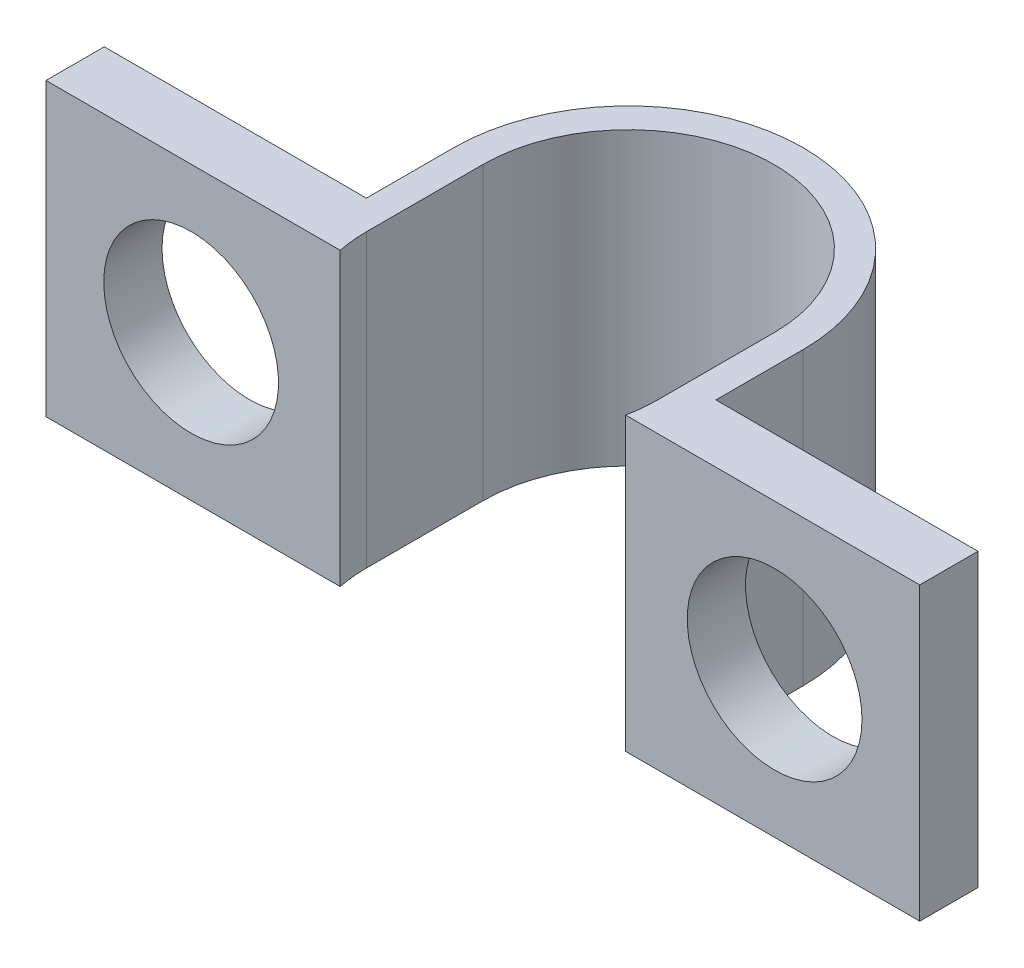
ISO-10303-21;
HEADER;
FILE_DESCRIPTION(('STEP AP214'),'2;1');
FILE_NAME('part.step','',(''),(''),'','','');
FILE_SCHEMA(('AUTOMOTIVE_DESIGN { 1 0 10303 214 1 1 1 1 }'));
ENDSEC;
DATA;
#1=APPLICATION_CONTEXT('core data for automotive mechanical design processes');
#2=APPLICATION_PROTOCOL_DEFINITION('international standard','automotive_design',2000,#1);
#3=PRODUCT_CONTEXT('',#1,'mechanical');
#4=PRODUCT('Part','Part','',(#3));
#5=PRODUCT_RELATED_PRODUCT_CATEGORY('part','',(#4));
#6=PRODUCT_DEFINITION_FORMATION('','',#4);
#7=PRODUCT_DEFINITION_CONTEXT('part definition',#1,'design');
#8=PRODUCT_DEFINITION('design','',#6,#7);
#9=PRODUCT_DEFINITION_SHAPE('','',#8);
#10=(LENGTH_UNIT() NAMED_UNIT(*) SI_UNIT(.MILLI.,.METRE.));
#11=(NAMED_UNIT(*) PLANE_ANGLE_UNIT() SI_UNIT($,.RADIAN.));
#12=(NAMED_UNIT(*) SI_UNIT($,.STERADIAN.) SOLID_ANGLE_UNIT());
#13=UNCERTAINTY_MEASURE_WITH_UNIT(LENGTH_MEASURE(1.E-05),#10,'distance_accuracy_value','');
#14=(GEOMETRIC_REPRESENTATION_CONTEXT(3) GLOBAL_UNCERTAINTY_ASSIGNED_CONTEXT((#13)) GLOBAL_UNIT_ASSIGNED_CONTEXT((#10,
#11,#12)) REPRESENTATION_CONTEXT('',''));
#15=CARTESIAN_POINT('',(0.,0.,0.));
#16=DIRECTION('',(0.,0.,1.));
#17=DIRECTION('',(1.,0.,0.));
#18=AXIS2_PLACEMENT_3D('',#15,#16,#17);
#19=CARTESIAN_POINT('',(2.44948974278318,5.,0.5));
#20=DIRECTION('',(0.,0.,-1.));
#21=DIRECTION('',(-1.,0.,0.));
#22=AXIS2_PLACEMENT_3D('',#19,#20,#21);
#23=PLANE('',#22);
#24=CARTESIAN_POINT('',(5.00842140633495,2.5,0.5));
#25=DIRECTION('',(0.,0.,-1.));
#26=DIRECTION('',(1.,0.,0.));
#27=AXIS2_PLACEMENT_3D('',#24,#25,#26);
#28=CIRCLE('',#27,1.5);
#29=CARTESIAN_POINT('',(6.50842140633495,2.5,0.5));
#30=VERTEX_POINT('',#29);
#31=EDGE_CURVE('E340',#30,#30,#28,.T.);
#32=ORIENTED_EDGE('',*,*,#31,.T.);
#33=EDGE_LOOP('',(#32));
#34=FACE_BOUND('',#33,.T.);
#35=DIRECTION('',(1.,0.,0.));
#36=VECTOR('',#35,1.);
#37=CARTESIAN_POINT('',(2.44948974278318,0.,0.5));
#38=LINE('',#37,#36);
#39=CARTESIAN_POINT('',(2.44948974278318,0.,0.5));
#40=VERTEX_POINT('',#39);
#41=CARTESIAN_POINT('',(7.5,0.,0.5));
#42=VERTEX_POINT('',#41);
#43=EDGE_CURVE('E182',#40,#42,#38,.T.);
#44=ORIENTED_EDGE('',*,*,#43,.T.);
#45=DIRECTION('',(0.,-1.,0.));
#46=VECTOR('',#45,1.);
#47=CARTESIAN_POINT('',(7.5,5.,0.5));
#48=LINE('',#47,#46);
#49=CARTESIAN_POINT('',(7.5,5.,0.5));
#50=VERTEX_POINT('',#49);
#51=EDGE_CURVE('E11',#50,#42,#48,.T.);
#52=ORIENTED_EDGE('',*,*,#51,.F.);
#53=DIRECTION('',(1.,0.,0.));
#54=VECTOR('',#53,1.);
#55=CARTESIAN_POINT('',(2.44948974278318,5.,0.5));
#56=LINE('',#55,#54);
#57=CARTESIAN_POINT('',(2.44948974278318,5.,0.5));
#58=VERTEX_POINT('',#57);
#59=EDGE_CURVE('E223',#58,#50,#56,.T.);
#60=ORIENTED_EDGE('',*,*,#59,.F.);
#61=DIRECTION('',(0.,-1.,0.));
#62=VECTOR('',#61,1.);
#63=CARTESIAN_POINT('',(2.44948974278318,5.,0.5));
#64=LINE('',#63,#62);
#65=EDGE_CURVE('E178',#58,#40,#64,.T.);
#66=ORIENTED_EDGE('',*,*,#65,.T.);
#67=EDGE_LOOP('',(#44,#52,#60,#66));
#68=FACE_BOUND('',#67,.T.);
#69=ADVANCED_FACE('F45',(#34,#68),#23,.F.);
#70=CARTESIAN_POINT('',(7.5,5.,-0.5));
#71=DIRECTION('',(-1.,0.,0.));
#72=DIRECTION('',(0.,0.,1.));
#73=AXIS2_PLACEMENT_3D('',#70,#71,#72);
#74=PLANE('',#73);
#75=DIRECTION('',(0.,0.,-1.));
#76=VECTOR('',#75,1.);
#77=CARTESIAN_POINT('',(7.5,0.,-0.5));
#78=LINE('',#77,#76);
#79=CARTESIAN_POINT('',(7.5,0.,-0.5));
#80=VERTEX_POINT('',#79);
#81=EDGE_CURVE('E186',#42,#80,#78,.T.);
#82=ORIENTED_EDGE('',*,*,#81,.T.);
#83=DIRECTION('',(0.,-1.,0.));
#84=VECTOR('',#83,1.);
#85=CARTESIAN_POINT('',(7.5,5.,-0.5));
#86=LINE('',#85,#84);
#87=CARTESIAN_POINT('',(7.5,5.,-0.5));
#88=VERTEX_POINT('',#87);
#89=EDGE_CURVE('E54',#88,#80,#86,.T.);
#90=ORIENTED_EDGE('',*,*,#89,.F.);
#91=DIRECTION('',(0.,0.,-1.));
#92=VECTOR('',#91,1.);
#93=CARTESIAN_POINT('',(7.5,5.,-0.5));
#94=LINE('',#93,#92);
#95=EDGE_CURVE('E123',#50,#88,#94,.T.);
#96=ORIENTED_EDGE('',*,*,#95,.F.);
#97=ORIENTED_EDGE('',*,*,#51,.T.);
#98=EDGE_LOOP('',(#82,#90,#96,#97));
#99=FACE_BOUND('',#98,.T.);
#100=ADVANCED_FACE('F331',(#99),#74,.F.);
#101=CARTESIAN_POINT('',(3.,5.,-0.5));
#102=DIRECTION('',(0.,0.,1.));
#103=DIRECTION('',(1.,0.,0.));
#104=AXIS2_PLACEMENT_3D('',#101,#102,#103);
#105=PLANE('',#104);
#106=CARTESIAN_POINT('',(5.00842140633495,2.5,-0.5));
#107=DIRECTION('',(0.,0.,-1.));
#108=DIRECTION('',(1.,0.,0.));
#109=AXIS2_PLACEMENT_3D('',#106,#107,#108);
#110=CIRCLE('',#109,1.5);
#111=CARTESIAN_POINT('',(6.50842140633495,2.5,-0.5));
#112=VERTEX_POINT('',#111);
#113=EDGE_CURVE('E343',#112,#112,#110,.T.);
#114=ORIENTED_EDGE('',*,*,#113,.F.);
#115=EDGE_LOOP('',(#114));
#116=FACE_BOUND('',#115,.T.);
#117=DIRECTION('',(-1.,0.,0.));
#118=VECTOR('',#117,1.);
#119=CARTESIAN_POINT('',(3.,0.,-0.5));
#120=LINE('',#119,#118);
#121=CARTESIAN_POINT('',(3.,0.,-0.5));
#122=VERTEX_POINT('',#121);
#123=EDGE_CURVE('E190',#80,#122,#120,.T.);
#124=ORIENTED_EDGE('',*,*,#123,.T.);
#125=DIRECTION('',(0.,-1.,0.));
#126=VECTOR('',#125,1.);
#127=CARTESIAN_POINT('',(3.,5.,-0.5));
#128=LINE('',#127,#126);
#129=CARTESIAN_POINT('',(3.,5.,-0.5));
#130=VERTEX_POINT('',#129);
#131=EDGE_CURVE('E258',#130,#122,#128,.T.);
#132=ORIENTED_EDGE('',*,*,#131,.F.);
#133=DIRECTION('',(-1.,0.,0.));
#134=VECTOR('',#133,1.);
#135=CARTESIAN_POINT('',(3.,5.,-0.5));
#136=LINE('',#135,#134);
#137=EDGE_CURVE('E268',#88,#130,#136,.T.);
#138=ORIENTED_EDGE('',*,*,#137,.F.);
#139=ORIENTED_EDGE('',*,*,#89,.T.);
#140=EDGE_LOOP('',(#124,#132,#138,#139));
#141=FACE_BOUND('',#140,.T.);
#142=ADVANCED_FACE('F266',(#116,#141),#105,.F.);
#143=CARTESIAN_POINT('',(3.,5.,-0.5));
#144=DIRECTION('',(-1.,0.,0.));
#145=DIRECTION('',(0.,0.,1.));
#146=AXIS2_PLACEMENT_3D('',#143,#144,#145);
#147=PLANE('',#146);
#148=DIRECTION('',(0.,0.,-1.));
#149=VECTOR('',#148,1.);
#150=CARTESIAN_POINT('',(3.,0.,-0.5));
#151=LINE('',#150,#149);
#152=CARTESIAN_POINT('',(3.,0.,-2.));
#153=VERTEX_POINT('',#152);
#154=EDGE_CURVE('E193',#122,#153,#151,.T.);
#155=ORIENTED_EDGE('',*,*,#154,.T.);
#156=DIRECTION('',(0.,-1.,0.));
#157=VECTOR('',#156,1.);
#158=CARTESIAN_POINT('',(3.,5.,-2.));
#159=LINE('',#158,#157);
#160=CARTESIAN_POINT('',(3.,5.,-2.));
#161=VERTEX_POINT('',#160);
#162=EDGE_CURVE('E254',#161,#153,#159,.T.);
#163=ORIENTED_EDGE('',*,*,#162,.F.);
#164=DIRECTION('',(0.,0.,-1.));
#165=VECTOR('',#164,1.);
#166=CARTESIAN_POINT('',(3.,5.,-0.5));
#167=LINE('',#166,#165);
#168=EDGE_CURVE('E287',#130,#161,#167,.T.);
#169=ORIENTED_EDGE('',*,*,#168,.F.);
#170=ORIENTED_EDGE('',*,*,#131,.T.);
#171=EDGE_LOOP('',(#155,#163,#169,#170));
#172=FACE_BOUND('',#171,.T.);
#173=ADVANCED_FACE('F277',(#172),#147,.F.);
#174=CARTESIAN_POINT('',(0.,5.,-2.));
#175=DIRECTION('',(0.,-1.,0.));
#176=DIRECTION('',(0.,0.,-1.));
#177=AXIS2_PLACEMENT_3D('',#174,#175,#176);
#178=CYLINDRICAL_SURFACE('',#177,3.);
#179=CARTESIAN_POINT('',(0.,0.,-2.));
#180=DIRECTION('',(0.,1.,0.));
#181=DIRECTION('',(0.,0.,1.));
#182=AXIS2_PLACEMENT_3D('',#179,#180,#181);
#183=CIRCLE('',#182,3.);
#184=CARTESIAN_POINT('',(-3.,0.,-2.));
#185=VERTEX_POINT('',#184);
#186=EDGE_CURVE('E196',#153,#185,#183,.T.);
#187=ORIENTED_EDGE('',*,*,#186,.T.);
#188=DIRECTION('',(0.,-1.,0.));
#189=VECTOR('',#188,1.);
#190=CARTESIAN_POINT('',(-3.,5.,-2.));
#191=LINE('',#190,#189);
#192=CARTESIAN_POINT('',(-3.,5.,-2.));
#193=VERTEX_POINT('',#192);
#194=EDGE_CURVE('E250',#193,#185,#191,.T.);
#195=ORIENTED_EDGE('',*,*,#194,.F.);
#196=CARTESIAN_POINT('',(0.,5.,-2.));
#197=DIRECTION('',(0.,1.,0.));
#198=DIRECTION('',(0.,0.,1.));
#199=AXIS2_PLACEMENT_3D('',#196,#197,#198);
#200=CIRCLE('',#199,3.);
#201=EDGE_CURVE('E283',#161,#193,#200,.T.);
#202=ORIENTED_EDGE('',*,*,#201,.F.);
#203=ORIENTED_EDGE('',*,*,#162,.T.);
#204=EDGE_LOOP('',(#187,#195,#202,#203));
#205=FACE_BOUND('',#204,.T.);
#206=ADVANCED_FACE('F281',(#205),#178,.T.);
#207=CARTESIAN_POINT('',(-3.,5.,-0.5));
#208=DIRECTION('',(1.,0.,0.));
#209=DIRECTION('',(0.,0.,-1.));
#210=AXIS2_PLACEMENT_3D('',#207,#208,#209);
#211=PLANE('',#210);
#212=DIRECTION('',(0.,0.,1.));
#213=VECTOR('',#212,1.);
#214=CARTESIAN_POINT('',(-3.,0.,-0.5));
#215=LINE('',#214,#213);
#216=CARTESIAN_POINT('',(-3.,0.,-0.5));
#217=VERTEX_POINT('',#216);
#218=EDGE_CURVE('E199',#185,#217,#215,.T.);
#219=ORIENTED_EDGE('',*,*,#218,.T.);
#220=DIRECTION('',(0.,-1.,0.));
#221=VECTOR('',#220,1.);
#222=CARTESIAN_POINT('',(-3.,5.,-0.5));
#223=LINE('',#222,#221);
#224=CARTESIAN_POINT('',(-3.,5.,-0.5));
#225=VERTEX_POINT('',#224);
#226=EDGE_CURVE('E246',#225,#217,#223,.T.);
#227=ORIENTED_EDGE('',*,*,#226,.F.);
#228=DIRECTION('',(0.,0.,1.));
#229=VECTOR('',#228,1.);
#230=CARTESIAN_POINT('',(-3.,5.,-0.5));
#231=LINE('',#230,#229);
#232=EDGE_CURVE('E286',#193,#225,#231,.T.);
#233=ORIENTED_EDGE('',*,*,#232,.F.);
#234=ORIENTED_EDGE('',*,*,#194,.T.);
#235=EDGE_LOOP('',(#219,#227,#233,#234));
#236=FACE_BOUND('',#235,.T.);
#237=ADVANCED_FACE('F368',(#236),#211,.F.);
#238=CARTESIAN_POINT('',(-7.5,5.,-0.5));
#239=DIRECTION('',(0.,0.,1.));
#240=DIRECTION('',(1.,0.,0.));
#241=AXIS2_PLACEMENT_3D('',#238,#239,#240);
#242=PLANE('',#241);
#243=CARTESIAN_POINT('',(-5.00842140633495,2.5,-0.5));
#244=DIRECTION('',(0.,0.,-1.));
#245=DIRECTION('',(-1.,0.,0.));
#246=AXIS2_PLACEMENT_3D('',#243,#244,#245);
#247=CIRCLE('',#246,1.5);
#248=CARTESIAN_POINT('',(-6.50842140633495,2.5,-0.5));
#249=VERTEX_POINT('',#248);
#250=EDGE_CURVE('E347',#249,#249,#247,.T.);
#251=ORIENTED_EDGE('',*,*,#250,.F.);
#252=EDGE_LOOP('',(#251));
#253=FACE_BOUND('',#252,.T.);
#254=DIRECTION('',(-1.,0.,0.));
#255=VECTOR('',#254,1.);
#256=CARTESIAN_POINT('',(-7.5,0.,-0.5));
#257=LINE('',#256,#255);
#258=CARTESIAN_POINT('',(-7.5,0.,-0.5));
#259=VERTEX_POINT('',#258);
#260=EDGE_CURVE('E202',#217,#259,#257,.T.);
#261=ORIENTED_EDGE('',*,*,#260,.T.);
#262=DIRECTION('',(0.,-1.,0.));
#263=VECTOR('',#262,1.);
#264=CARTESIAN_POINT('',(-7.5,5.,-0.5));
#265=LINE('',#264,#263);
#266=CARTESIAN_POINT('',(-7.5,5.,-0.5));
#267=VERTEX_POINT('',#266);
#268=EDGE_CURVE('E242',#267,#259,#265,.T.);
#269=ORIENTED_EDGE('',*,*,#268,.F.);
#270=DIRECTION('',(-1.,0.,0.));
#271=VECTOR('',#270,1.);
#272=CARTESIAN_POINT('',(-7.5,5.,-0.5));
#273=LINE('',#272,#271);
#274=EDGE_CURVE('E291',#225,#267,#273,.T.);
#275=ORIENTED_EDGE('',*,*,#274,.F.);
#276=ORIENTED_EDGE('',*,*,#226,.T.);
#277=EDGE_LOOP('',(#261,#269,#275,#276));
#278=FACE_BOUND('',#277,.T.);
#279=ADVANCED_FACE('F364',(#253,#278),#242,.F.);
#280=CARTESIAN_POINT('',(-7.5,5.,-0.5));
#281=DIRECTION('',(1.,0.,0.));
#282=DIRECTION('',(0.,0.,-1.));
#283=AXIS2_PLACEMENT_3D('',#280,#281,#282);
#284=PLANE('',#283);
#285=DIRECTION('',(0.,0.,1.));
#286=VECTOR('',#285,1.);
#287=CARTESIAN_POINT('',(-7.5,0.,-0.5));
#288=LINE('',#287,#286);
#289=CARTESIAN_POINT('',(-7.5,0.,0.5));
#290=VERTEX_POINT('',#289);
#291=EDGE_CURVE('E205',#259,#290,#288,.T.);
#292=ORIENTED_EDGE('',*,*,#291,.T.);
#293=DIRECTION('',(0.,-1.,0.));
#294=VECTOR('',#293,1.);
#295=CARTESIAN_POINT('',(-7.5,5.,0.5));
#296=LINE('',#295,#294);
#297=CARTESIAN_POINT('',(-7.5,5.,0.5));
#298=VERTEX_POINT('',#297);
#299=EDGE_CURVE('E238',#298,#290,#296,.T.);
#300=ORIENTED_EDGE('',*,*,#299,.F.);
#301=DIRECTION('',(0.,0.,1.));
#302=VECTOR('',#301,1.);
#303=CARTESIAN_POINT('',(-7.5,5.,-0.5));
#304=LINE('',#303,#302);
#305=EDGE_CURVE('E298',#267,#298,#304,.T.);
#306=ORIENTED_EDGE('',*,*,#305,.F.);
#307=ORIENTED_EDGE('',*,*,#268,.T.);
#308=EDGE_LOOP('',(#292,#300,#306,#307));
#309=FACE_BOUND('',#308,.T.);
#310=ADVANCED_FACE('F367',(#309),#284,.F.);
#311=CARTESIAN_POINT('',(-7.5,5.,0.5));
#312=DIRECTION('',(0.,0.,-1.));
#313=DIRECTION('',(-1.,0.,0.));
#314=AXIS2_PLACEMENT_3D('',#311,#312,#313);
#315=PLANE('',#314);
#316=CARTESIAN_POINT('',(-5.00842140633495,2.5,0.5));
#317=DIRECTION('',(0.,0.,-1.));
#318=DIRECTION('',(-1.,0.,0.));
#319=AXIS2_PLACEMENT_3D('',#316,#317,#318);
#320=CIRCLE('',#319,1.5);
#321=CARTESIAN_POINT('',(-6.50842140633495,2.5,0.5));
#322=VERTEX_POINT('',#321);
#323=EDGE_CURVE('E187',#322,#322,#320,.T.);
#324=ORIENTED_EDGE('',*,*,#323,.T.);
#325=EDGE_LOOP('',(#324));
#326=FACE_BOUND('',#325,.T.);
#327=DIRECTION('',(1.,0.,0.));
#328=VECTOR('',#327,1.);
#329=CARTESIAN_POINT('',(-7.5,0.,0.5));
#330=LINE('',#329,#328);
#331=CARTESIAN_POINT('',(-2.44948974278318,0.,0.5));
#332=VERTEX_POINT('',#331);
#333=EDGE_CURVE('E208',#290,#332,#330,.T.);
#334=ORIENTED_EDGE('',*,*,#333,.T.);
#335=DIRECTION('',(0.,-1.,0.));
#336=VECTOR('',#335,1.);
#337=CARTESIAN_POINT('',(-2.44948974278318,5.,0.5));
#338=LINE('',#337,#336);
#339=CARTESIAN_POINT('',(-2.44948974278318,5.,0.5));
#340=VERTEX_POINT('',#339);
#341=EDGE_CURVE('E234',#340,#332,#338,.T.);
#342=ORIENTED_EDGE('',*,*,#341,.F.);
#343=DIRECTION('',(1.,0.,0.));
#344=VECTOR('',#343,1.);
#345=CARTESIAN_POINT('',(-7.5,5.,0.5));
#346=LINE('',#345,#344);
#347=EDGE_CURVE('E301',#298,#340,#346,.T.);
#348=ORIENTED_EDGE('',*,*,#347,.F.);
#349=ORIENTED_EDGE('',*,*,#299,.T.);
#350=EDGE_LOOP('',(#334,#342,#348,#349));
#351=FACE_BOUND('',#350,.T.);
#352=ADVANCED_FACE('F380',(#326,#351),#315,.F.);
#353=CARTESIAN_POINT('',(0.,5.,0.));
#354=DIRECTION('',(0.,-1.,0.));
#355=DIRECTION('',(0.,0.,-1.));
#356=AXIS2_PLACEMENT_3D('',#353,#354,#355);
#357=CYLINDRICAL_SURFACE('',#356,2.5);
#358=CARTESIAN_POINT('',(0.,0.,0.));
#359=DIRECTION('',(0.,-1.,0.));
#360=DIRECTION('',(0.,0.,1.));
#361=AXIS2_PLACEMENT_3D('',#358,#359,#360);
#362=CIRCLE('',#361,2.5);
#363=CARTESIAN_POINT('',(-2.5,0.,0.));
#364=VERTEX_POINT('',#363);
#365=EDGE_CURVE('E211',#332,#364,#362,.T.);
#366=ORIENTED_EDGE('',*,*,#365,.T.);
#367=DIRECTION('',(0.,-1.,0.));
#368=VECTOR('',#367,1.);
#369=CARTESIAN_POINT('',(-2.5,5.,0.));
#370=LINE('',#369,#368);
#371=CARTESIAN_POINT('',(-2.5,5.,0.));
#372=VERTEX_POINT('',#371);
#373=EDGE_CURVE('E230',#372,#364,#370,.T.);
#374=ORIENTED_EDGE('',*,*,#373,.F.);
#375=CARTESIAN_POINT('',(0.,5.,0.));
#376=DIRECTION('',(0.,-1.,0.));
#377=DIRECTION('',(0.,0.,1.));
#378=AXIS2_PLACEMENT_3D('',#375,#376,#377);
#379=CIRCLE('',#378,2.5);
#380=EDGE_CURVE('E304',#340,#372,#379,.T.);
#381=ORIENTED_EDGE('',*,*,#380,.F.);
#382=ORIENTED_EDGE('',*,*,#341,.T.);
#383=EDGE_LOOP('',(#366,#374,#381,#382));
#384=FACE_BOUND('',#383,.T.);
#385=ADVANCED_FACE('F312',(#384),#357,.F.);
#386=CARTESIAN_POINT('',(-2.5,5.,0.));
#387=DIRECTION('',(-1.,0.,0.));
#388=DIRECTION('',(0.,0.,1.));
#389=AXIS2_PLACEMENT_3D('',#386,#387,#388);
#390=PLANE('',#389);
#391=DIRECTION('',(0.,0.,-1.));
#392=VECTOR('',#391,1.);
#393=CARTESIAN_POINT('',(-2.5,0.,0.));
#394=LINE('',#393,#392);
#395=CARTESIAN_POINT('',(-2.5,0.,-2.));
#396=VERTEX_POINT('',#395);
#397=EDGE_CURVE('E214',#364,#396,#394,.T.);
#398=ORIENTED_EDGE('',*,*,#397,.T.);
#399=DIRECTION('',(0.,-1.,0.));
#400=VECTOR('',#399,1.);
#401=CARTESIAN_POINT('',(-2.5,5.,-2.));
#402=LINE('',#401,#400);
#403=CARTESIAN_POINT('',(-2.5,5.,-2.));
#404=VERTEX_POINT('',#403);
#405=EDGE_CURVE('E171',#404,#396,#402,.T.);
#406=ORIENTED_EDGE('',*,*,#405,.F.);
#407=DIRECTION('',(0.,0.,-1.));
#408=VECTOR('',#407,1.);
#409=CARTESIAN_POINT('',(-2.5,5.,0.));
#410=LINE('',#409,#408);
#411=EDGE_CURVE('E160',#372,#404,#410,.T.);
#412=ORIENTED_EDGE('',*,*,#411,.F.);
#413=ORIENTED_EDGE('',*,*,#373,.T.);
#414=EDGE_LOOP('',(#398,#406,#412,#413));
#415=FACE_BOUND('',#414,.T.);
#416=ADVANCED_FACE('F316',(#415),#390,.F.);
#417=CARTESIAN_POINT('',(0.,5.,-2.));
#418=DIRECTION('',(0.,-1.,0.));
#419=DIRECTION('',(0.,0.,-1.));
#420=AXIS2_PLACEMENT_3D('',#417,#418,#419);
#421=CYLINDRICAL_SURFACE('',#420,2.5);
#422=CARTESIAN_POINT('',(0.,0.,-2.));
#423=DIRECTION('',(0.,-1.,0.));
#424=DIRECTION('',(0.,0.,1.));
#425=AXIS2_PLACEMENT_3D('',#422,#423,#424);
#426=CIRCLE('',#425,2.5);
#427=CARTESIAN_POINT('',(2.5,0.,-2.));
#428=VERTEX_POINT('',#427);
#429=EDGE_CURVE('E169',#396,#428,#426,.T.);
#430=ORIENTED_EDGE('',*,*,#429,.T.);
#431=DIRECTION('',(0.,-1.,0.));
#432=VECTOR('',#431,1.);
#433=CARTESIAN_POINT('',(2.5,5.,-2.));
#434=LINE('',#433,#432);
#435=CARTESIAN_POINT('',(2.5,5.,-2.));
#436=VERTEX_POINT('',#435);
#437=EDGE_CURVE('E166',#436,#428,#434,.T.);
#438=ORIENTED_EDGE('',*,*,#437,.F.);
#439=CARTESIAN_POINT('',(0.,5.,-2.));
#440=DIRECTION('',(0.,-1.,0.));
#441=DIRECTION('',(0.,0.,1.));
#442=AXIS2_PLACEMENT_3D('',#439,#440,#441);
#443=CIRCLE('',#442,2.5);
#444=EDGE_CURVE('E154',#404,#436,#443,.T.);
#445=ORIENTED_EDGE('',*,*,#444,.F.);
#446=ORIENTED_EDGE('',*,*,#405,.T.);
#447=EDGE_LOOP('',(#430,#438,#445,#446));
#448=FACE_BOUND('',#447,.T.);
#449=ADVANCED_FACE('F167',(#448),#421,.F.);
#450=CARTESIAN_POINT('',(2.5,5.,0.));
#451=DIRECTION('',(1.,0.,0.));
#452=DIRECTION('',(0.,0.,-1.));
#453=AXIS2_PLACEMENT_3D('',#450,#451,#452);
#454=PLANE('',#453);
#455=DIRECTION('',(0.,0.,1.));
#456=VECTOR('',#455,1.);
#457=CARTESIAN_POINT('',(2.5,0.,0.));
#458=LINE('',#457,#456);
#459=CARTESIAN_POINT('',(2.5,0.,0.));
#460=VERTEX_POINT('',#459);
#461=EDGE_CURVE('E109',#428,#460,#458,.T.);
#462=ORIENTED_EDGE('',*,*,#461,.T.);
#463=DIRECTION('',(0.,-1.,0.));
#464=VECTOR('',#463,1.);
#465=CARTESIAN_POINT('',(2.5,5.,0.));
#466=LINE('',#465,#464);
#467=CARTESIAN_POINT('',(2.5,5.,0.));
#468=VERTEX_POINT('',#467);
#469=EDGE_CURVE('E172',#468,#460,#466,.T.);
#470=ORIENTED_EDGE('',*,*,#469,.F.);
#471=DIRECTION('',(0.,0.,1.));
#472=VECTOR('',#471,1.);
#473=CARTESIAN_POINT('',(2.5,5.,0.));
#474=LINE('',#473,#472);
#475=EDGE_CURVE('E158',#436,#468,#474,.T.);
#476=ORIENTED_EDGE('',*,*,#475,.F.);
#477=ORIENTED_EDGE('',*,*,#437,.T.);
#478=EDGE_LOOP('',(#462,#470,#476,#477));
#479=FACE_BOUND('',#478,.T.);
#480=ADVANCED_FACE('F174',(#479),#454,.F.);
#481=CARTESIAN_POINT('',(0.,5.,0.));
#482=DIRECTION('',(0.,-1.,0.));
#483=DIRECTION('',(0.,0.,-1.));
#484=AXIS2_PLACEMENT_3D('',#481,#482,#483);
#485=CYLINDRICAL_SURFACE('',#484,2.5);
#486=CARTESIAN_POINT('',(0.,0.,0.));
#487=DIRECTION('',(0.,-1.,0.));
#488=DIRECTION('',(0.,0.,1.));
#489=AXIS2_PLACEMENT_3D('',#486,#487,#488);
#490=CIRCLE('',#489,2.5);
#491=EDGE_CURVE('E115',#460,#40,#490,.T.);
#492=ORIENTED_EDGE('',*,*,#491,.T.);
#493=ORIENTED_EDGE('',*,*,#65,.F.);
#494=CARTESIAN_POINT('',(0.,5.,0.));
#495=DIRECTION('',(0.,-1.,0.));
#496=DIRECTION('',(0.,0.,1.));
#497=AXIS2_PLACEMENT_3D('',#494,#495,#496);
#498=CIRCLE('',#497,2.5);
#499=EDGE_CURVE('E62',#468,#58,#498,.T.);
#500=ORIENTED_EDGE('',*,*,#499,.F.);
#501=ORIENTED_EDGE('',*,*,#469,.T.);
#502=EDGE_LOOP('',(#492,#493,#500,#501));
#503=FACE_BOUND('',#502,.T.);
#504=ADVANCED_FACE('F320',(#503),#485,.F.);
#505=CARTESIAN_POINT('',(0.,5.,-2.));
#506=DIRECTION('',(0.,1.,0.));
#507=DIRECTION('',(0.,0.,1.));
#508=AXIS2_PLACEMENT_3D('',#505,#506,#507);
#509=PLANE('',#508);
#510=ORIENTED_EDGE('',*,*,#59,.T.);
#511=ORIENTED_EDGE('',*,*,#95,.T.);
#512=ORIENTED_EDGE('',*,*,#137,.T.);
#513=ORIENTED_EDGE('',*,*,#168,.T.);
#514=ORIENTED_EDGE('',*,*,#201,.T.);
#515=ORIENTED_EDGE('',*,*,#232,.T.);
#516=ORIENTED_EDGE('',*,*,#274,.T.);
#517=ORIENTED_EDGE('',*,*,#305,.T.);
#518=ORIENTED_EDGE('',*,*,#347,.T.);
#519=ORIENTED_EDGE('',*,*,#380,.T.);
#520=ORIENTED_EDGE('',*,*,#411,.T.);
#521=ORIENTED_EDGE('',*,*,#444,.T.);
#522=ORIENTED_EDGE('',*,*,#475,.T.);
#523=ORIENTED_EDGE('',*,*,#499,.T.);
#524=EDGE_LOOP('',(#510,#511,#512,#513,#514,#515,#516,#517,#518,#519,#520,#521,#522,#523));
#525=FACE_BOUND('',#524,.T.);
#526=ADVANCED_FACE('F156',(#525),#509,.T.);
#527=CARTESIAN_POINT('',(0.,0.,-2.));
#528=DIRECTION('',(0.,1.,0.));
#529=DIRECTION('',(0.,0.,1.));
#530=AXIS2_PLACEMENT_3D('',#527,#528,#529);
#531=PLANE('',#530);
#532=ORIENTED_EDGE('',*,*,#43,.F.);
#533=ORIENTED_EDGE('',*,*,#491,.F.);
#534=ORIENTED_EDGE('',*,*,#461,.F.);
#535=ORIENTED_EDGE('',*,*,#429,.F.);
#536=ORIENTED_EDGE('',*,*,#397,.F.);
#537=ORIENTED_EDGE('',*,*,#365,.F.);
#538=ORIENTED_EDGE('',*,*,#333,.F.);
#539=ORIENTED_EDGE('',*,*,#291,.F.);
#540=ORIENTED_EDGE('',*,*,#260,.F.);
#541=ORIENTED_EDGE('',*,*,#218,.F.);
#542=ORIENTED_EDGE('',*,*,#186,.F.);
#543=ORIENTED_EDGE('',*,*,#154,.F.);
#544=ORIENTED_EDGE('',*,*,#123,.F.);
#545=ORIENTED_EDGE('',*,*,#81,.F.);
#546=EDGE_LOOP('',(#532,#533,#534,#535,#536,#537,#538,#539,#540,#541,#542,#543,#544,#545));
#547=FACE_BOUND('',#546,.T.);
#548=ADVANCED_FACE('F272',(#547),#531,.F.);
#549=CARTESIAN_POINT('',(-5.00842140633495,2.5,0.5));
#550=DIRECTION('',(0.,0.,-1.));
#551=DIRECTION('',(-1.,0.,0.));
#552=AXIS2_PLACEMENT_3D('',#549,#550,#551);
#553=CYLINDRICAL_SURFACE('',#552,1.5);
#554=ORIENTED_EDGE('',*,*,#323,.F.);
#555=EDGE_LOOP('',(#554));
#556=FACE_BOUND('',#555,.T.);
#557=ORIENTED_EDGE('',*,*,#250,.T.);
#558=EDGE_LOOP('',(#557));
#559=FACE_BOUND('',#558,.T.);
#560=ADVANCED_FACE('F362',(#556,#559),#553,.F.);
#561=CARTESIAN_POINT('',(5.00842140633495,2.5,0.5));
#562=DIRECTION('',(0.,0.,-1.));
#563=DIRECTION('',(-1.,0.,0.));
#564=AXIS2_PLACEMENT_3D('',#561,#562,#563);
#565=CYLINDRICAL_SURFACE('',#564,1.5);
#566=ORIENTED_EDGE('',*,*,#31,.F.);
#567=EDGE_LOOP('',(#566));
#568=FACE_BOUND('',#567,.T.);
#569=ORIENTED_EDGE('',*,*,#113,.T.);
#570=EDGE_LOOP('',(#569));
#571=FACE_BOUND('',#570,.T.);
#572=ADVANCED_FACE('F405',(#568,#571),#565,.F.);
#573=CLOSED_SHELL('',(#69,#100,#142,#173,#206,#237,#279,#310,#352,#385,#416,#449,#480,#504,#526,
#548,#560,#572));
#574=MANIFOLD_SOLID_BREP('B2',#573);
#575=ADVANCED_BREP_SHAPE_REPRESENTATION('',(#18,#574),#14);
#576=SHAPE_DEFINITION_REPRESENTATION(#9,#575);
ENDSEC;
END-ISO-10303-21;
